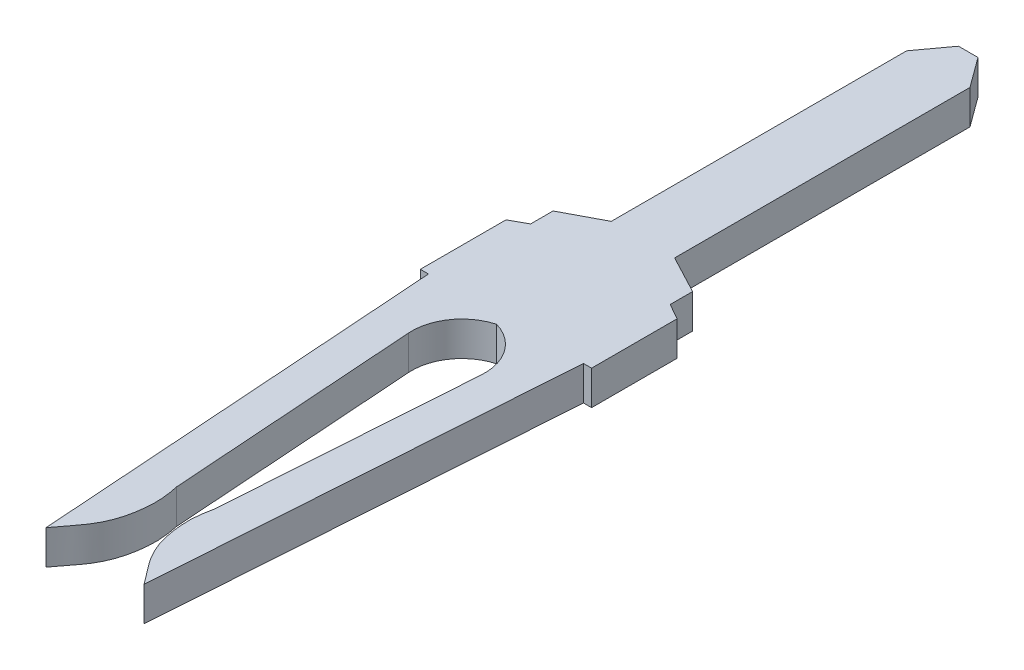
ISO-10303-21;
HEADER;
FILE_DESCRIPTION(('STEP AP214'),'2;1');
FILE_NAME('part.step','',(''),(''),'','','');
FILE_SCHEMA(('AUTOMOTIVE_DESIGN { 1 0 10303 214 1 1 1 1 }'));
ENDSEC;
DATA;
#1=APPLICATION_CONTEXT('core data for automotive mechanical design processes');
#2=APPLICATION_PROTOCOL_DEFINITION('international standard','automotive_design',2000,#1);
#3=PRODUCT_CONTEXT('',#1,'mechanical');
#4=PRODUCT('Part','Part','',(#3));
#5=PRODUCT_RELATED_PRODUCT_CATEGORY('part','',(#4));
#6=PRODUCT_DEFINITION_FORMATION('','',#4);
#7=PRODUCT_DEFINITION_CONTEXT('part definition',#1,'design');
#8=PRODUCT_DEFINITION('design','',#6,#7);
#9=PRODUCT_DEFINITION_SHAPE('','',#8);
#10=(LENGTH_UNIT() NAMED_UNIT(*) SI_UNIT(.MILLI.,.METRE.));
#11=(NAMED_UNIT(*) PLANE_ANGLE_UNIT() SI_UNIT($,.RADIAN.));
#12=(NAMED_UNIT(*) SI_UNIT($,.STERADIAN.) SOLID_ANGLE_UNIT());
#13=UNCERTAINTY_MEASURE_WITH_UNIT(LENGTH_MEASURE(1.E-05),#10,'distance_accuracy_value','');
#14=(GEOMETRIC_REPRESENTATION_CONTEXT(3) GLOBAL_UNCERTAINTY_ASSIGNED_CONTEXT((#13)) GLOBAL_UNIT_ASSIGNED_CONTEXT((#10,
#11,#12)) REPRESENTATION_CONTEXT('',''));
#15=CARTESIAN_POINT('',(0.,0.,0.));
#16=DIRECTION('',(0.,0.,1.));
#17=DIRECTION('',(1.,0.,0.));
#18=AXIS2_PLACEMENT_3D('',#15,#16,#17);
#19=CARTESIAN_POINT('',(13.7238483037714,-0.2,2.31459805115651));
#20=DIRECTION('',(0.,1.,0.));
#21=DIRECTION('',(0.,0.,1.));
#22=AXIS2_PLACEMENT_3D('',#19,#20,#21);
#23=PLANE('',#22);
#24=DIRECTION('',(1.,0.,0.));
#25=VECTOR('',#24,1.);
#26=CARTESIAN_POINT('',(13.7238483037714,-0.2,-7.36150336113542));
#27=LINE('',#26,#25);
#28=CARTESIAN_POINT('',(14.0838737533966,-0.2,-7.36150336113542));
#29=VERTEX_POINT('',#28);
#30=CARTESIAN_POINT('',(13.8561262466034,-0.2,-7.36150336113542));
#31=VERTEX_POINT('',#30);
#32=EDGE_CURVE('E283',#29,#31,#27,.F.);
#33=ORIENTED_EDGE('',*,*,#32,.F.);
#34=DIRECTION('',(-0.590553070886652,0.,-0.806998804501187));
#35=VECTOR('',#34,1.);
#36=CARTESIAN_POINT('',(14.34,-0.2,-7.01150336113544));
#37=LINE('',#36,#35);
#38=CARTESIAN_POINT('',(14.34,-0.2,-7.01150336113544));
#39=VERTEX_POINT('',#38);
#40=EDGE_CURVE('E332',#39,#29,#37,.T.);
#41=ORIENTED_EDGE('',*,*,#40,.F.);
#42=DIRECTION('',(0.,0.,1.));
#43=VECTOR('',#42,1.);
#44=CARTESIAN_POINT('',(14.34,-0.2,-3.56150336113542));
#45=LINE('',#44,#43);
#46=CARTESIAN_POINT('',(14.34,-0.2,-3.56150336113542));
#47=VERTEX_POINT('',#46);
#48=EDGE_CURVE('E342',#39,#47,#45,.T.);
#49=ORIENTED_EDGE('',*,*,#48,.T.);
#50=DIRECTION('',(0.884537528884384,0.,0.466469034336801));
#51=VECTOR('',#50,1.);
#52=CARTESIAN_POINT('',(14.7850492275891,-0.2,-3.32680254104964));
#53=LINE('',#52,#51);
#54=CARTESIAN_POINT('',(14.7850492275891,-0.2,-3.32680254104964));
#55=VERTEX_POINT('',#54);
#56=EDGE_CURVE('E512',#47,#55,#53,.T.);
#57=ORIENTED_EDGE('',*,*,#56,.T.);
#58=DIRECTION('',(0.,0.,1.));
#59=VECTOR('',#58,1.);
#60=CARTESIAN_POINT('',(14.7850492275891,-0.2,-3.0643625168085));
#61=LINE('',#60,#59);
#62=CARTESIAN_POINT('',(14.7850492275891,-0.2,-3.0643625168085));
#63=VERTEX_POINT('',#62);
#64=EDGE_CURVE('E517',#55,#63,#61,.T.);
#65=ORIENTED_EDGE('',*,*,#64,.T.);
#66=DIRECTION('',(0.873939082125311,0.,0.486035472711579));
#67=VECTOR('',#66,1.);
#68=CARTESIAN_POINT('',(14.97,-0.2,-2.96150336113542));
#69=LINE('',#68,#67);
#70=CARTESIAN_POINT('',(14.97,-0.2,-2.96150336113542));
#71=VERTEX_POINT('',#70);
#72=EDGE_CURVE('E522',#63,#71,#69,.T.);
#73=ORIENTED_EDGE('',*,*,#72,.T.);
#74=DIRECTION('',(0.,0.,1.));
#75=VECTOR('',#74,1.);
#76=CARTESIAN_POINT('',(14.97,-0.2,-1.96150336113542));
#77=LINE('',#76,#75);
#78=CARTESIAN_POINT('',(14.97,-0.2,-1.96150336113542));
#79=VERTEX_POINT('',#78);
#80=EDGE_CURVE('E527',#71,#79,#77,.T.);
#81=ORIENTED_EDGE('',*,*,#80,.T.);
#82=DIRECTION('',(-1.,0.,0.));
#83=VECTOR('',#82,1.);
#84=CARTESIAN_POINT('',(14.8753470294773,-0.2,-1.96150336113542));
#85=LINE('',#84,#83);
#86=CARTESIAN_POINT('',(14.8753470294773,-0.2,-1.96150336113542));
#87=VERTEX_POINT('',#86);
#88=EDGE_CURVE('E293',#79,#87,#85,.T.);
#89=ORIENTED_EDGE('',*,*,#88,.T.);
#90=DIRECTION('',(-0.069129081289101,0.,0.997607723566796));
#91=VECTOR('',#90,1.);
#92=CARTESIAN_POINT('',(14.5427317315511,-0.2,2.83849663886458));
#93=LINE('',#92,#91);
#94=CARTESIAN_POINT('',(14.5427317315511,-0.199999999998636,2.83849663886458));
#95=VERTEX_POINT('',#94);
#96=EDGE_CURVE('E286',#87,#95,#93,.T.);
#97=ORIENTED_EDGE('',*,*,#96,.T.);
#98=CARTESIAN_POINT('',(14.5427317315511,-0.199999999997272,2.83849663886458));
#99=CARTESIAN_POINT('',(14.5301117840465,-0.199999999999036,2.82035634566084));
#100=CARTESIAN_POINT('',(14.5171085897647,-0.199999999999745,2.80249703632862));
#101=CARTESIAN_POINT('',(14.4905978922961,-0.200000000000256,2.767067271672));
#102=CARTESIAN_POINT('',(14.4770889362865,-0.200000000000054,2.74949789706299));
#103=CARTESIAN_POINT('',(14.4498889977379,-0.199999999999946,2.71445646704448));
#104=CARTESIAN_POINT('',(14.436197747636,-0.200000000000041,2.69698462458868));
#105=CARTESIAN_POINT('',(14.4088690336099,-0.199999999999959,2.66179280032601));
#106=CARTESIAN_POINT('',(14.3952326861093,-0.199999999999781,2.64407193802588));
#107=CARTESIAN_POINT('',(14.3684870174647,-0.200000000000219,2.60827495637831));
#108=CARTESIAN_POINT('',(14.3553768963667,-0.200000000000835,2.59019944367523));
#109=CARTESIAN_POINT('',(14.3301101020069,-0.199999999999166,2.55341394187299));
#110=CARTESIAN_POINT('',(14.3179523577802,-0.199999999996886,2.53470470035233));
#111=CARTESIAN_POINT('',(14.2888528005844,-0.199999999995555,2.48610541444836));
#112=CARTESIAN_POINT('',(14.2728705856211,-0.199999999998911,2.4556309694467));
#113=CARTESIAN_POINT('',(14.2442782559242,-0.20000000000109,2.39311864961096));
#114=CARTESIAN_POINT('',(14.2316716205826,-0.199999999999908,2.36107920154643));
#115=CARTESIAN_POINT('',(14.2098063400518,-0.200000000000092,2.29605579046403));
#116=CARTESIAN_POINT('',(14.2005321464449,-0.200000000001447,2.26307700968106));
#117=CARTESIAN_POINT('',(14.1849803350698,-0.199999999998552,2.19641558649373));
#118=CARTESIAN_POINT('',(14.1787038833698,-0.199999999994301,2.1627326755041));
#119=CARTESIAN_POINT('',(14.1716427674148,-0.199999999997239,2.11445873714291));
#120=CARTESIAN_POINT('',(14.1697745540675,-0.199999999999259,2.10001577275484));
#121=CARTESIAN_POINT('',(14.1664895700981,-0.200000000000741,2.07107657672707));
#122=CARTESIAN_POINT('',(14.1650728382844,-0.200000000000201,2.0565803406165));
#123=CARTESIAN_POINT('',(14.162648947746,-0.199999999999799,2.02756428018602));
#124=CARTESIAN_POINT('',(14.1616415125079,-0.199999999999936,2.01304447846682));
#125=CARTESIAN_POINT('',(14.1600578978784,-0.200000000000065,1.98398161590975));
#126=CARTESIAN_POINT('',(14.1594816668501,-0.200000000000057,1.96943855806589));
#127=CARTESIAN_POINT('',(14.1589515619759,-0.199999999999943,1.94031677784536));
#128=CARTESIAN_POINT('',(14.1589986410578,-0.199999999999836,1.92573803493692));
#129=CARTESIAN_POINT('',(14.1597587559285,-0.200000000000164,1.89659865640506));
#130=CARTESIAN_POINT('',(14.1604717976268,-0.200000000000597,1.88203802094347));
#131=CARTESIAN_POINT('',(14.1635527888558,-0.199999999998806,1.8384276765421));
#132=CARTESIAN_POINT('',(14.1668624883897,-0.199999999993491,1.8094421190335));
#133=CARTESIAN_POINT('',(14.1725344170494,-0.199999999997351,1.77067562522561));
#134=CARTESIAN_POINT('',(14.1740951039794,-0.19999999999931,1.76076333321757));
#135=CARTESIAN_POINT('',(14.1774047974131,-0.20000000000069,1.74097125618797));
#136=CARTESIAN_POINT('',(14.1791537702163,-0.20000000000011,1.73109146567429));
#137=CARTESIAN_POINT('',(14.1828119125698,-0.19999999999989,1.71138684020899));
#138=CARTESIAN_POINT('',(14.1847206822217,-0.200000000000248,1.70156193004253));
#139=CARTESIAN_POINT('',(14.1886821532455,-0.199999999999752,1.68194070150381));
#140=CARTESIAN_POINT('',(14.1907348605041,-0.199999999998897,1.67214438431805));
#141=CARTESIAN_POINT('',(14.1928494979964,-0.199999999996362,1.66236165258835));
#142=B_SPLINE_CURVE_WITH_KNOTS('',3,(#98,#99,#100,#101,#102,#103,#104,#105,#106,#107,#108,#109,
#110,#111,#112,#113,#114,#115,#116,#117,#118,#119,#120,#121,#122,#123,#124,#125,#126,#127,#128,
#129,#130,#131,#132,#133,#134,#135,#136,#137,#138,#139,#140,#141),.UNSPECIFIED.,.F.,.F.,(4,2,2,
2,2,2,2,2,2,2,2,2,2,2,2,2,2,2,2,2,2,4),(0.,0.0662736292421371,0.132754965588503,
0.199347935146056,0.266425503105106,0.333396909133083,0.400291890006224,0.503292496143717,
0.606398865394113,0.709017718069728,0.811676455205095,0.855361428713374,0.899050156292408,
0.942709319294032,0.986363253255563,1.03008393384267,1.07380500239372,1.16122498556328,
1.19132837323275,1.221426381764,1.25145119993663,1.28147724680278),.UNSPECIFIED.);
#143=CARTESIAN_POINT('',(14.1928494979964,-0.199999999998636,1.66236165258835));
#144=VERTEX_POINT('',#143);
#145=EDGE_CURVE('E377',#95,#144,#142,.T.);
#146=ORIENTED_EDGE('',*,*,#145,.T.);
#147=DIRECTION('',(0.0691290812891009,0.,-0.997607723566796));
#148=VECTOR('',#147,1.);
#149=CARTESIAN_POINT('',(14.3944850572742,-0.2,-1.2474584626244));
#150=LINE('',#149,#148);
#151=CARTESIAN_POINT('',(14.3944850572742,-0.2,-1.2474584626244));
#152=VERTEX_POINT('',#151);
#153=EDGE_CURVE('E299',#144,#152,#150,.T.);
#154=ORIENTED_EDGE('',*,*,#153,.T.);
#155=CARTESIAN_POINT('',(13.8111858150643,-0.2,-1.28787809829685));
#156=DIRECTION('',(0.,-1.,0.));
#157=DIRECTION('',(0.,0.,-1.));
#158=AXIS2_PLACEMENT_3D('',#155,#156,#157);
#159=CIRCLE('',#158,0.584698001459304);
#160=CARTESIAN_POINT('',(13.97,-0.2,-1.85059455227142));
#161=VERTEX_POINT('',#160);
#162=EDGE_CURVE('E541',#152,#161,#159,.F.);
#163=ORIENTED_EDGE('',*,*,#162,.T.);
#164=CARTESIAN_POINT('',(14.1288141849357,-0.2,-1.28787809829685));
#165=DIRECTION('',(0.,-1.,0.));
#166=DIRECTION('',(0.,0.,-1.));
#167=AXIS2_PLACEMENT_3D('',#164,#165,#166);
#168=CIRCLE('',#167,0.584698001459304);
#169=CARTESIAN_POINT('',(13.5455149427258,-0.2,-1.2474584626244));
#170=VERTEX_POINT('',#169);
#171=EDGE_CURVE('E543',#161,#170,#168,.F.);
#172=ORIENTED_EDGE('',*,*,#171,.T.);
#173=DIRECTION('',(0.0691290812891009,0.,0.997607723566796));
#174=VECTOR('',#173,1.);
#175=CARTESIAN_POINT('',(13.7471505020036,-0.2,1.66236165258835));
#176=LINE('',#175,#174);
#177=CARTESIAN_POINT('',(13.7471505020036,-0.199999999998636,1.66236165258835));
#178=VERTEX_POINT('',#177);
#179=EDGE_CURVE('E193',#170,#178,#176,.T.);
#180=ORIENTED_EDGE('',*,*,#179,.T.);
#181=CARTESIAN_POINT('',(13.7471505020036,-0.199999999997272,1.66236165258835));
#182=CARTESIAN_POINT('',(13.7506930434582,-0.199999999999021,1.67876516898736));
#183=CARTESIAN_POINT('',(13.7540668961465,-0.199999999999738,1.69520814063054));
#184=CARTESIAN_POINT('',(13.760373512311,-0.200000000000262,1.72819425344364));
#185=CARTESIAN_POINT('',(13.7633058514325,-0.200000000000069,1.74473747528483));
#186=CARTESIAN_POINT('',(13.768612950942,-0.199999999999931,1.77787904842356));
#187=CARTESIAN_POINT('',(13.7709888742904,-0.199999999999986,1.79447720985483));
#188=CARTESIAN_POINT('',(13.7750561261357,-0.200000000000014,1.82775267562321));
#189=CARTESIAN_POINT('',(13.7767477090657,-0.199999999999986,1.84442994820983));
#190=CARTESIAN_POINT('',(13.7793404639229,-0.200000000000014,1.8781658536101));
#191=CARTESIAN_POINT('',(13.7802260479731,-0.200000000000071,1.89522572372273));
#192=CARTESIAN_POINT('',(13.781074176234,-0.199999999999929,1.92937070365721));
#193=CARTESIAN_POINT('',(13.7810365963276,-0.199999999999728,1.94645581656411));
#194=CARTESIAN_POINT('',(13.7801464087162,-0.200000000000272,1.98060739462667));
#195=CARTESIAN_POINT('',(13.7792934932804,-0.200000000001016,1.99767385030562));
#196=CARTESIAN_POINT('',(13.7770512403936,-0.199999999998984,2.03177190457364));
#197=CARTESIAN_POINT('',(13.7756618445344,-0.199999999996208,2.04880349916423));
#198=CARTESIAN_POINT('',(13.7724418258441,-0.199999999996501,2.08117364432391));
#199=CARTESIAN_POINT('',(13.7706664509372,-0.199999999999035,2.09651757337598));
#200=CARTESIAN_POINT('',(13.7665920149137,-0.200000000000965,2.12713142079618));
#201=CARTESIAN_POINT('',(13.7642930727049,-0.200000000000362,2.14240135516632));
#202=CARTESIAN_POINT('',(13.7565568923818,-0.199999999999275,2.18806423356644));
#203=CARTESIAN_POINT('',(13.7502792180355,-0.199999999999511,2.21832169210074));
#204=CARTESIAN_POINT('',(13.7353049896006,-0.200000000000485,2.27794628837999));
#205=CARTESIAN_POINT('',(13.7266307283313,-0.200000000001218,2.30731899012436));
#206=CARTESIAN_POINT('',(13.7066639429989,-0.199999999998782,2.36515776174417));
#207=CARTESIAN_POINT('',(13.6953725781304,-0.199999999995614,2.3936242266889));
#208=CARTESIAN_POINT('',(13.6741167492533,-0.199999999996873,2.44050994607598));
#209=CARTESIAN_POINT('',(13.6648651860701,-0.199999999999213,2.45925514878721));
#210=CARTESIAN_POINT('',(13.6451148381145,-0.200000000000787,2.49607002593636));
#211=CARTESIAN_POINT('',(13.634616549394,-0.200000000000022,2.51413996531327));
#212=CARTESIAN_POINT('',(13.6124016014869,-0.199999999999977,2.5496512250529));
#213=CARTESIAN_POINT('',(13.6006783041642,-0.200000000000705,2.56708834895095));
#214=CARTESIAN_POINT('',(13.5765014836541,-0.199999999999295,2.60145165600187));
#215=CARTESIAN_POINT('',(13.5640476322362,-0.199999999997155,2.61837760423457));
#216=CARTESIAN_POINT('',(13.5256576601351,-0.199999999994748,2.66929403747489));
#217=CARTESIAN_POINT('',(13.4991085517752,-0.19999999999871,2.70281440404767));
#218=CARTESIAN_POINT('',(13.4599612186542,-0.200000000000638,2.75332926249143));
#219=CARTESIAN_POINT('',(13.4470934447163,-0.200000000000622,2.77011410702205));
#220=CARTESIAN_POINT('',(13.4217901054739,-0.199999999999378,2.80401275870947));
#221=CARTESIAN_POINT('',(13.4093546734732,-0.199999999998149,2.82112666484357));
#222=CARTESIAN_POINT('',(13.3972682684489,-0.199999999996362,2.83849663886458));
#223=B_SPLINE_CURVE_WITH_KNOTS('',3,(#181,#182,#183,#184,#185,#186,#187,#188,#189,#190,#191,
#192,#193,#194,#195,#196,#197,#198,#199,#200,#201,#202,#203,#204,#205,#206,#207,#208,#209,#210,
#211,#212,#213,#214,#215,#216,#217,#218,#219,#220,#221,#222),.UNSPECIFIED.,.F.,.F.,(4,2,2,2,2,2,
2,2,2,2,2,2,2,2,2,2,2,2,2,2,4),(0.,0.0503486093503747,0.100745305838358,0.151035709247431,
0.201307397797674,0.252531860559853,0.303763210359028,0.35501390396404,0.406270178969422,
0.4525996658291,0.498918641247276,0.591522198393347,0.683291796484336,0.775020824454853,
0.837689524225669,0.900333372155572,0.963336258472885,1.02636767143342,1.15463805260592,
1.21808246522332,1.28154626921388),.UNSPECIFIED.);
#224=CARTESIAN_POINT('',(13.3972682684489,-0.199999999998636,2.83849663886458));
#225=VERTEX_POINT('',#224);
#226=EDGE_CURVE('E24',#178,#225,#223,.T.);
#227=ORIENTED_EDGE('',*,*,#226,.T.);
#228=DIRECTION('',(-0.069129081289101,0.,-0.997607723566796));
#229=VECTOR('',#228,1.);
#230=CARTESIAN_POINT('',(13.0646529705227,-0.2,-1.96150336113542));
#231=LINE('',#230,#229);
#232=CARTESIAN_POINT('',(13.0646529705227,-0.2,-1.96150336113542));
#233=VERTEX_POINT('',#232);
#234=EDGE_CURVE('E182',#225,#233,#231,.T.);
#235=ORIENTED_EDGE('',*,*,#234,.T.);
#236=DIRECTION('',(-1.,0.,0.));
#237=VECTOR('',#236,1.);
#238=CARTESIAN_POINT('',(12.97,-0.2,-1.96150336113542));
#239=LINE('',#238,#237);
#240=CARTESIAN_POINT('',(12.97,-0.2,-1.96150336113542));
#241=VERTEX_POINT('',#240);
#242=EDGE_CURVE('E205',#233,#241,#239,.T.);
#243=ORIENTED_EDGE('',*,*,#242,.T.);
#244=DIRECTION('',(0.,0.,-1.));
#245=VECTOR('',#244,1.);
#246=CARTESIAN_POINT('',(12.97,-0.2,-2.96150336113542));
#247=LINE('',#246,#245);
#248=CARTESIAN_POINT('',(12.97,-0.2,-2.96150336113542));
#249=VERTEX_POINT('',#248);
#250=EDGE_CURVE('E217',#241,#249,#247,.T.);
#251=ORIENTED_EDGE('',*,*,#250,.T.);
#252=DIRECTION('',(0.873939082125311,0.,-0.486035472711579));
#253=VECTOR('',#252,1.);
#254=CARTESIAN_POINT('',(13.1549507724109,-0.2,-3.0643625168085));
#255=LINE('',#254,#253);
#256=CARTESIAN_POINT('',(13.1549507724109,-0.2,-3.0643625168085));
#257=VERTEX_POINT('',#256);
#258=EDGE_CURVE('E227',#249,#257,#255,.T.);
#259=ORIENTED_EDGE('',*,*,#258,.T.);
#260=DIRECTION('',(0.,0.,-1.));
#261=VECTOR('',#260,1.);
#262=CARTESIAN_POINT('',(13.1549507724109,-0.2,-3.32680254104964));
#263=LINE('',#262,#261);
#264=CARTESIAN_POINT('',(13.1549507724109,-0.2,-3.32680254104964));
#265=VERTEX_POINT('',#264);
#266=EDGE_CURVE('E237',#257,#265,#263,.T.);
#267=ORIENTED_EDGE('',*,*,#266,.T.);
#268=DIRECTION('',(0.884537528884384,0.,-0.466469034336801));
#269=VECTOR('',#268,1.);
#270=CARTESIAN_POINT('',(13.6,-0.2,-3.56150336113542));
#271=LINE('',#270,#269);
#272=CARTESIAN_POINT('',(13.6,-0.2,-3.56150336113542));
#273=VERTEX_POINT('',#272);
#274=EDGE_CURVE('E247',#265,#273,#271,.T.);
#275=ORIENTED_EDGE('',*,*,#274,.T.);
#276=DIRECTION('',(0.,0.,-1.));
#277=VECTOR('',#276,1.);
#278=CARTESIAN_POINT('',(13.6,-0.2,-7.01150336113544));
#279=LINE('',#278,#277);
#280=CARTESIAN_POINT('',(13.6,-0.2,-7.01150336113544));
#281=VERTEX_POINT('',#280);
#282=EDGE_CURVE('E257',#273,#281,#279,.T.);
#283=ORIENTED_EDGE('',*,*,#282,.T.);
#284=DIRECTION('',(0.590553070886641,0.,-0.806998804501195));
#285=VECTOR('',#284,1.);
#286=CARTESIAN_POINT('',(13.8561262466034,-0.2,-7.36150336113542));
#287=LINE('',#286,#285);
#288=EDGE_CURVE('E267',#281,#31,#287,.T.);
#289=ORIENTED_EDGE('',*,*,#288,.T.);
#290=EDGE_LOOP('',(#33,#41,#49,#57,#65,#73,#81,#89,#97,#146,#154,#163,#172,#180,#227,#235,#243,
#251,#259,#267,#275,#283,#289));
#291=FACE_BOUND('',#290,.T.);
#292=ADVANCED_FACE('F17',(#291),#23,.F.);
#293=CARTESIAN_POINT('',(13.8561262466034,0.2,-7.36150336113542));
#294=DIRECTION('',(0.806998804501195,0.,0.590553070886641));
#295=DIRECTION('',(0.590553070886641,0.,-0.806998804501195));
#296=AXIS2_PLACEMENT_3D('',#293,#294,#295);
#297=PLANE('',#296);
#298=DIRECTION('',(0.,1.,0.));
#299=VECTOR('',#298,1.);
#300=CARTESIAN_POINT('',(13.6,0.2,-7.01150336113544));
#301=LINE('',#300,#299);
#302=CARTESIAN_POINT('',(13.6,0.2,-7.01150336113544));
#303=VERTEX_POINT('',#302);
#304=EDGE_CURVE('E265',#281,#303,#301,.T.);
#305=ORIENTED_EDGE('',*,*,#304,.T.);
#306=DIRECTION('',(-0.590553070886652,0.,0.806998804501187));
#307=VECTOR('',#306,1.);
#308=CARTESIAN_POINT('',(13.8561262466034,0.2,-7.36150336113542));
#309=LINE('',#308,#307);
#310=CARTESIAN_POINT('',(13.8561262466034,0.2,-7.36150336113542));
#311=VERTEX_POINT('',#310);
#312=EDGE_CURVE('E262',#311,#303,#309,.T.);
#313=ORIENTED_EDGE('',*,*,#312,.F.);
#314=DIRECTION('',(0.,1.,0.));
#315=VECTOR('',#314,1.);
#316=CARTESIAN_POINT('',(13.8561262466034,0.2,-7.36150336113542));
#317=LINE('',#316,#315);
#318=EDGE_CURVE('E272',#311,#31,#317,.F.);
#319=ORIENTED_EDGE('',*,*,#318,.T.);
#320=ORIENTED_EDGE('',*,*,#288,.F.);
#321=EDGE_LOOP('',(#305,#313,#319,#320));
#322=FACE_BOUND('',#321,.T.);
#323=ADVANCED_FACE('F396',(#322),#297,.F.);
#324=CARTESIAN_POINT('',(13.6,0.2,-7.01150336113544));
#325=DIRECTION('',(1.,0.,0.));
#326=DIRECTION('',(0.,0.,-1.));
#327=AXIS2_PLACEMENT_3D('',#324,#325,#326);
#328=PLANE('',#327);
#329=DIRECTION('',(0.,1.,0.));
#330=VECTOR('',#329,1.);
#331=CARTESIAN_POINT('',(13.6,0.2,-3.56150336113542));
#332=LINE('',#331,#330);
#333=CARTESIAN_POINT('',(13.6,0.2,-3.56150336113542));
#334=VERTEX_POINT('',#333);
#335=EDGE_CURVE('E255',#273,#334,#332,.T.);
#336=ORIENTED_EDGE('',*,*,#335,.T.);
#337=DIRECTION('',(0.,0.,1.));
#338=VECTOR('',#337,1.);
#339=CARTESIAN_POINT('',(13.6,0.2,2.31459805115651));
#340=LINE('',#339,#338);
#341=EDGE_CURVE('E252',#303,#334,#340,.T.);
#342=ORIENTED_EDGE('',*,*,#341,.F.);
#343=ORIENTED_EDGE('',*,*,#304,.F.);
#344=ORIENTED_EDGE('',*,*,#282,.F.);
#345=EDGE_LOOP('',(#336,#342,#343,#344));
#346=FACE_BOUND('',#345,.T.);
#347=ADVANCED_FACE('F400',(#346),#328,.F.);
#348=CARTESIAN_POINT('',(13.6,0.2,-3.56150336113542));
#349=DIRECTION('',(0.466469034336801,0.,0.884537528884384));
#350=DIRECTION('',(0.884537528884384,0.,-0.466469034336801));
#351=AXIS2_PLACEMENT_3D('',#348,#349,#350);
#352=PLANE('',#351);
#353=DIRECTION('',(0.,1.,0.));
#354=VECTOR('',#353,1.);
#355=CARTESIAN_POINT('',(13.1549507724109,0.2,-3.32680254104964));
#356=LINE('',#355,#354);
#357=CARTESIAN_POINT('',(13.1549507724109,0.2,-3.32680254104964));
#358=VERTEX_POINT('',#357);
#359=EDGE_CURVE('E245',#265,#358,#356,.T.);
#360=ORIENTED_EDGE('',*,*,#359,.T.);
#361=DIRECTION('',(-0.884537528884383,0.,0.466469034336803));
#362=VECTOR('',#361,1.);
#363=CARTESIAN_POINT('',(13.6,0.2,-3.56150336113542));
#364=LINE('',#363,#362);
#365=EDGE_CURVE('E242',#334,#358,#364,.T.);
#366=ORIENTED_EDGE('',*,*,#365,.F.);
#367=ORIENTED_EDGE('',*,*,#335,.F.);
#368=ORIENTED_EDGE('',*,*,#274,.F.);
#369=EDGE_LOOP('',(#360,#366,#367,#368));
#370=FACE_BOUND('',#369,.T.);
#371=ADVANCED_FACE('F404',(#370),#352,.F.);
#372=CARTESIAN_POINT('',(13.1549507724109,0.2,-3.32680254104964));
#373=DIRECTION('',(1.,0.,0.));
#374=DIRECTION('',(0.,0.,-1.));
#375=AXIS2_PLACEMENT_3D('',#372,#373,#374);
#376=PLANE('',#375);
#377=DIRECTION('',(0.,1.,0.));
#378=VECTOR('',#377,1.);
#379=CARTESIAN_POINT('',(13.1549507724109,0.2,-3.0643625168085));
#380=LINE('',#379,#378);
#381=CARTESIAN_POINT('',(13.1549507724109,0.2,-3.0643625168085));
#382=VERTEX_POINT('',#381);
#383=EDGE_CURVE('E235',#257,#382,#380,.T.);
#384=ORIENTED_EDGE('',*,*,#383,.T.);
#385=DIRECTION('',(0.,0.,1.));
#386=VECTOR('',#385,1.);
#387=CARTESIAN_POINT('',(13.1549507724109,0.2,2.31459805115651));
#388=LINE('',#387,#386);
#389=EDGE_CURVE('E232',#358,#382,#388,.T.);
#390=ORIENTED_EDGE('',*,*,#389,.F.);
#391=ORIENTED_EDGE('',*,*,#359,.F.);
#392=ORIENTED_EDGE('',*,*,#266,.F.);
#393=EDGE_LOOP('',(#384,#390,#391,#392));
#394=FACE_BOUND('',#393,.T.);
#395=ADVANCED_FACE('F408',(#394),#376,.F.);
#396=CARTESIAN_POINT('',(13.1549507724109,0.2,-3.0643625168085));
#397=DIRECTION('',(0.486035472711579,0.,0.873939082125311));
#398=DIRECTION('',(0.873939082125311,0.,-0.486035472711579));
#399=AXIS2_PLACEMENT_3D('',#396,#397,#398);
#400=PLANE('',#399);
#401=DIRECTION('',(0.,1.,0.));
#402=VECTOR('',#401,1.);
#403=CARTESIAN_POINT('',(12.97,0.2,-2.96150336113542));
#404=LINE('',#403,#402);
#405=CARTESIAN_POINT('',(12.97,0.2,-2.96150336113542));
#406=VERTEX_POINT('',#405);
#407=EDGE_CURVE('E225',#249,#406,#404,.T.);
#408=ORIENTED_EDGE('',*,*,#407,.T.);
#409=DIRECTION('',(-0.873939082125311,0.,0.486035472711581));
#410=VECTOR('',#409,1.);
#411=CARTESIAN_POINT('',(13.1549507724109,0.2,-3.0643625168085));
#412=LINE('',#411,#410);
#413=EDGE_CURVE('E222',#382,#406,#412,.T.);
#414=ORIENTED_EDGE('',*,*,#413,.F.);
#415=ORIENTED_EDGE('',*,*,#383,.F.);
#416=ORIENTED_EDGE('',*,*,#258,.F.);
#417=EDGE_LOOP('',(#408,#414,#415,#416));
#418=FACE_BOUND('',#417,.T.);
#419=ADVANCED_FACE('F412',(#418),#400,.F.);
#420=CARTESIAN_POINT('',(12.97,0.2,-2.96150336113542));
#421=DIRECTION('',(1.,0.,0.));
#422=DIRECTION('',(0.,0.,-1.));
#423=AXIS2_PLACEMENT_3D('',#420,#421,#422);
#424=PLANE('',#423);
#425=DIRECTION('',(0.,1.,0.));
#426=VECTOR('',#425,1.);
#427=CARTESIAN_POINT('',(12.97,0.2,-1.96150336113542));
#428=LINE('',#427,#426);
#429=CARTESIAN_POINT('',(12.97,0.2,-1.96150336113542));
#430=VERTEX_POINT('',#429);
#431=EDGE_CURVE('E215',#241,#430,#428,.T.);
#432=ORIENTED_EDGE('',*,*,#431,.T.);
#433=DIRECTION('',(0.,0.,1.));
#434=VECTOR('',#433,1.);
#435=CARTESIAN_POINT('',(12.97,0.2,2.31459805115651));
#436=LINE('',#435,#434);
#437=EDGE_CURVE('E212',#406,#430,#436,.T.);
#438=ORIENTED_EDGE('',*,*,#437,.F.);
#439=ORIENTED_EDGE('',*,*,#407,.F.);
#440=ORIENTED_EDGE('',*,*,#250,.F.);
#441=EDGE_LOOP('',(#432,#438,#439,#440));
#442=FACE_BOUND('',#441,.T.);
#443=ADVANCED_FACE('F416',(#442),#424,.F.);
#444=CARTESIAN_POINT('',(12.97,0.2,-1.96150336113542));
#445=DIRECTION('',(0.,0.,-1.));
#446=DIRECTION('',(-1.,0.,0.));
#447=AXIS2_PLACEMENT_3D('',#444,#445,#446);
#448=PLANE('',#447);
#449=DIRECTION('',(0.,1.,0.));
#450=VECTOR('',#449,1.);
#451=CARTESIAN_POINT('',(13.0646529705227,0.2,-1.96150336113542));
#452=LINE('',#451,#450);
#453=CARTESIAN_POINT('',(13.0646529705227,0.2,-1.96150336113542));
#454=VERTEX_POINT('',#453);
#455=EDGE_CURVE('E187',#233,#454,#452,.T.);
#456=ORIENTED_EDGE('',*,*,#455,.T.);
#457=DIRECTION('',(1.,0.,0.));
#458=VECTOR('',#457,1.);
#459=CARTESIAN_POINT('',(13.7238483037714,0.2,-1.96150336113542));
#460=LINE('',#459,#458);
#461=EDGE_CURVE('E208',#430,#454,#460,.T.);
#462=ORIENTED_EDGE('',*,*,#461,.F.);
#463=ORIENTED_EDGE('',*,*,#431,.F.);
#464=ORIENTED_EDGE('',*,*,#242,.F.);
#465=EDGE_LOOP('',(#456,#462,#463,#464));
#466=FACE_BOUND('',#465,.T.);
#467=ADVANCED_FACE('F420',(#466),#448,.F.);
#468=CARTESIAN_POINT('',(13.0646529705227,0.2,-1.96150336113542));
#469=DIRECTION('',(0.997607723566796,0.,-0.069129081289101));
#470=DIRECTION('',(-0.069129081289101,0.,-0.997607723566796));
#471=AXIS2_PLACEMENT_3D('',#468,#469,#470);
#472=PLANE('',#471);
#473=DIRECTION('',(0.,1.,0.));
#474=VECTOR('',#473,1.);
#475=CARTESIAN_POINT('',(13.3972682684489,7.27594525427866E-13,2.83849663886458));
#476=LINE('',#475,#474);
#477=CARTESIAN_POINT('',(13.3972682684489,0.199999999999727,2.83849663886458));
#478=VERTEX_POINT('',#477);
#479=EDGE_CURVE('E185',#225,#478,#476,.T.);
#480=ORIENTED_EDGE('',*,*,#479,.T.);
#481=DIRECTION('',(0.0691290812891011,0.,0.997607723566796));
#482=VECTOR('',#481,1.);
#483=CARTESIAN_POINT('',(13.0646529705227,0.2,-1.96150336113542));
#484=LINE('',#483,#482);
#485=EDGE_CURVE('E211',#454,#478,#484,.T.);
#486=ORIENTED_EDGE('',*,*,#485,.F.);
#487=ORIENTED_EDGE('',*,*,#455,.F.);
#488=ORIENTED_EDGE('',*,*,#234,.F.);
#489=EDGE_LOOP('',(#480,#486,#487,#488));
#490=FACE_BOUND('',#489,.T.);
#491=ADVANCED_FACE('F183',(#490),#472,.F.);
#492=CARTESIAN_POINT('',(13.3972682684489,0.199999999999636,2.83849663886458));
#493=CARTESIAN_POINT('',(13.3972682684489,-0.199999999998181,2.83849663886458));
#494=CARTESIAN_POINT('',(13.4736771410361,0.199999999999636,2.72867175501363));
#495=CARTESIAN_POINT('',(13.4736771410361,-0.199999999998181,2.72867175501363));
#496=CARTESIAN_POINT('',(13.6984603558022,0.199999999999636,2.48163512099619));
#497=CARTESIAN_POINT('',(13.6984603558022,-0.199999999998181,2.48163512099619));
#498=CARTESIAN_POINT('',(13.788558845723,0.199999999999636,2.09927230325975));
#499=CARTESIAN_POINT('',(13.788558845723,-0.199999999998181,2.09927230325975));
#500=CARTESIAN_POINT('',(13.7820146019548,0.199999999999636,1.82360961972657));
#501=CARTESIAN_POINT('',(13.7820146019548,-0.199999999998181,1.82360961972657));
#502=CARTESIAN_POINT('',(13.7471505020036,0.199999999999636,1.66236165258835));
#503=CARTESIAN_POINT('',(13.7471505020036,-0.199999999998181,1.66236165258835));
#504=B_SPLINE_SURFACE_WITH_KNOTS('',3,1,((#492,#493),(#494,#495),(#496,#497),(#498,#499),(#500,
#501),(#502,#503)),.UNSPECIFIED.,.F.,.F.,.F.,(4,1,1,4),(2,2),(0.,0.306412493735712,
0.766000125066746,1.),(0.,0.399999999997817),.UNSPECIFIED.);
#505=DIRECTION('',(0.,1.,0.));
#506=VECTOR('',#505,1.);
#507=CARTESIAN_POINT('',(13.7471505020036,0.2,1.66236165258835));
#508=LINE('',#507,#506);
#509=CARTESIAN_POINT('',(13.7471505020036,0.2,1.66236165258835));
#510=VERTEX_POINT('',#509);
#511=EDGE_CURVE('E195',#178,#510,#508,.T.);
#512=CARTESIAN_POINT('',(13.3972682684489,0.199999999999454,2.83849663886458));
#513=CARTESIAN_POINT('',(13.4098882159535,0.199999999999805,2.82035634566084));
#514=CARTESIAN_POINT('',(13.4228914102353,0.199999999999948,2.80249703632862));
#515=CARTESIAN_POINT('',(13.4494021077039,0.200000000000052,2.767067271672));
#516=CARTESIAN_POINT('',(13.4629110637135,0.200000000000012,2.749497897063));
#517=CARTESIAN_POINT('',(13.4901110022621,0.199999999999988,2.71445646704449));
#518=CARTESIAN_POINT('',(13.503802252364,0.200000000000002,2.69698462458868));
#519=CARTESIAN_POINT('',(13.5311309663901,0.199999999999998,2.66179280032601));
#520=CARTESIAN_POINT('',(13.5447673138907,0.199999999999979,2.64407193802589));
#521=CARTESIAN_POINT('',(13.5715129825353,0.200000000000021,2.60827495637831));
#522=CARTESIAN_POINT('',(13.5846231036333,0.200000000000083,2.59019944367523));
#523=CARTESIAN_POINT('',(13.6098898979931,0.199999999999917,2.55341394187299));
#524=CARTESIAN_POINT('',(13.6220476422198,0.199999999999689,2.53470470035233));
#525=CARTESIAN_POINT('',(13.6511471994156,0.199999999999555,2.48610541444836));
#526=CARTESIAN_POINT('',(13.6671294143789,0.199999999999891,2.4556309694467));
#527=CARTESIAN_POINT('',(13.6957217440758,0.200000000000109,2.39311864961096));
#528=CARTESIAN_POINT('',(13.7083283794174,0.199999999999991,2.36107920154642));
#529=CARTESIAN_POINT('',(13.7301936599482,0.200000000000009,2.29605579046403));
#530=CARTESIAN_POINT('',(13.7394678535551,0.200000000000145,2.26307700968106));
#531=CARTESIAN_POINT('',(13.7550196649302,0.199999999999855,2.19641558649373));
#532=CARTESIAN_POINT('',(13.7612961166302,0.19999999999943,2.1627326755041));
#533=CARTESIAN_POINT('',(13.7683572325852,0.199999999999724,2.11445873714291));
#534=CARTESIAN_POINT('',(13.7702254459325,0.199999999999926,2.10001577275484));
#535=CARTESIAN_POINT('',(13.7735104299019,0.200000000000074,2.07107657672707));
#536=CARTESIAN_POINT('',(13.7749271617156,0.20000000000002,2.0565803406165));
#537=CARTESIAN_POINT('',(13.777351052254,0.19999999999998,2.02756428018602));
#538=CARTESIAN_POINT('',(13.7783584874921,0.199999999999994,2.01304447846682));
#539=CARTESIAN_POINT('',(13.7799421021216,0.200000000000006,1.98398161590974));
#540=CARTESIAN_POINT('',(13.7805183331499,0.200000000000006,1.96943855806589));
#541=CARTESIAN_POINT('',(13.7810484380241,0.199999999999994,1.94031677784536));
#542=CARTESIAN_POINT('',(13.7810013589422,0.199999999999984,1.92573803493692));
#543=CARTESIAN_POINT('',(13.7802412440715,0.200000000000016,1.89659865640506));
#544=CARTESIAN_POINT('',(13.7795282023732,0.20000000000006,1.88203802094346));
#545=CARTESIAN_POINT('',(13.7764472111442,0.199999999999881,1.83842767654209));
#546=CARTESIAN_POINT('',(13.7731375116103,0.199999999999349,1.8094421190335));
#547=CARTESIAN_POINT('',(13.7674655829506,0.199999999999735,1.77067562522561));
#548=CARTESIAN_POINT('',(13.7659048960206,0.199999999999931,1.76076333321756));
#549=CARTESIAN_POINT('',(13.7625952025869,0.200000000000069,1.74097125618797));
#550=CARTESIAN_POINT('',(13.7608462297837,0.200000000000011,1.73109146567429));
#551=CARTESIAN_POINT('',(13.7571880874302,0.199999999999989,1.71138684020899));
#552=CARTESIAN_POINT('',(13.7552793177783,0.200000000000025,1.70156193004253));
#553=CARTESIAN_POINT('',(13.7513178467545,0.199999999999975,1.68194070150381));
#554=CARTESIAN_POINT('',(13.7492651394959,0.19999999999989,1.67214438431805));
#555=CARTESIAN_POINT('',(13.7471505020036,0.199999999999636,1.66236165258835));
#556=B_SPLINE_CURVE_WITH_KNOTS('',3,(#512,#513,#514,#515,#516,#517,#518,#519,#520,#521,#522,
#523,#524,#525,#526,#527,#528,#529,#530,#531,#532,#533,#534,#535,#536,#537,#538,#539,#540,#541,
#542,#543,#544,#545,#546,#547,#548,#549,#550,#551,#552,#553,#554,#555),.UNSPECIFIED.,.F.,.F.,(4,
2,2,2,2,2,2,2,2,2,2,2,2,2,2,2,2,2,2,2,2,4),(0.,0.0662736292421344,0.132754965588502,
0.199347935146054,0.266425503105104,0.333396909133082,0.400291890006223,0.503292496143717,
0.606398865394114,0.709017718069729,0.811676455205097,0.855361428713376,0.899050156292409,
0.942709319294034,0.986363253255566,1.03008393384267,1.07380500239372,1.16122498556329,
1.19132837323275,1.221426381764,1.25145119993663,1.28147724680278),.UNSPECIFIED.);
#557=EDGE_CURVE('E198',#478,#510,#556,.T.);
#558=ORIENTED_EDGE('',*,*,#511,.T.);
#559=ORIENTED_EDGE('',*,*,#557,.F.);
#560=ORIENTED_EDGE('',*,*,#479,.F.);
#561=ORIENTED_EDGE('',*,*,#226,.F.);
#562=EDGE_LOOP('',(#558,#559,#560,#561));
#563=FACE_BOUND('',#562,.T.);
#564=ADVANCED_FACE('F196',(#563),#504,.F.);
#565=CARTESIAN_POINT('',(13.7471505020036,0.2,1.66236165258835));
#566=DIRECTION('',(-0.997607723566796,0.,0.0691290812891009));
#567=DIRECTION('',(0.0691290812891009,0.,0.997607723566796));
#568=AXIS2_PLACEMENT_3D('',#565,#566,#567);
#569=PLANE('',#568);
#570=DIRECTION('',(0.,-1.,0.));
#571=VECTOR('',#570,1.);
#572=CARTESIAN_POINT('',(13.5455149427258,0.2,-1.2474584626244));
#573=LINE('',#572,#571);
#574=CARTESIAN_POINT('',(13.5455149427258,0.2,-1.2474584626244));
#575=VERTEX_POINT('',#574);
#576=EDGE_CURVE('E304',#170,#575,#573,.F.);
#577=ORIENTED_EDGE('',*,*,#576,.T.);
#578=DIRECTION('',(-0.0691290812891005,0.,-0.997607723566796));
#579=VECTOR('',#578,1.);
#580=CARTESIAN_POINT('',(13.7471505020036,0.2,1.66236165258835));
#581=LINE('',#580,#579);
#582=EDGE_CURVE('E375',#510,#575,#581,.T.);
#583=ORIENTED_EDGE('',*,*,#582,.F.);
#584=ORIENTED_EDGE('',*,*,#511,.F.);
#585=ORIENTED_EDGE('',*,*,#179,.F.);
#586=EDGE_LOOP('',(#577,#583,#584,#585));
#587=FACE_BOUND('',#586,.T.);
#588=ADVANCED_FACE('F386',(#587),#569,.F.);
#589=CARTESIAN_POINT('',(14.1288141849357,0.2,-1.28787809829685));
#590=DIRECTION('',(0.,-1.,0.));
#591=DIRECTION('',(0.,0.,-1.));
#592=AXIS2_PLACEMENT_3D('',#589,#590,#591);
#593=CYLINDRICAL_SURFACE('',#592,0.584698001459304);
#594=DIRECTION('',(0.,-1.,0.));
#595=VECTOR('',#594,1.);
#596=CARTESIAN_POINT('',(13.97,0.2,-1.85059455227142));
#597=LINE('',#596,#595);
#598=CARTESIAN_POINT('',(13.97,0.2,-1.85059455227142));
#599=VERTEX_POINT('',#598);
#600=EDGE_CURVE('E542',#161,#599,#597,.F.);
#601=ORIENTED_EDGE('',*,*,#600,.T.);
#602=CARTESIAN_POINT('',(14.1288141849357,0.2,-1.28787809829685));
#603=DIRECTION('',(0.,-1.,0.));
#604=DIRECTION('',(0.,0.,-1.));
#605=AXIS2_PLACEMENT_3D('',#602,#603,#604);
#606=CIRCLE('',#605,0.584698001459304);
#607=EDGE_CURVE('E376',#575,#599,#606,.T.);
#608=ORIENTED_EDGE('',*,*,#607,.F.);
#609=ORIENTED_EDGE('',*,*,#576,.F.);
#610=ORIENTED_EDGE('',*,*,#171,.F.);
#611=EDGE_LOOP('',(#601,#608,#609,#610));
#612=FACE_BOUND('',#611,.T.);
#613=ADVANCED_FACE('F429',(#612),#593,.F.);
#614=CARTESIAN_POINT('',(13.8111858150643,0.2,-1.28787809829685));
#615=DIRECTION('',(0.,-1.,0.));
#616=DIRECTION('',(0.,0.,-1.));
#617=AXIS2_PLACEMENT_3D('',#614,#615,#616);
#618=CYLINDRICAL_SURFACE('',#617,0.584698001459304);
#619=DIRECTION('',(0.,1.,0.));
#620=VECTOR('',#619,1.);
#621=CARTESIAN_POINT('',(14.3944850572742,0.2,-1.2474584626244));
#622=LINE('',#621,#620);
#623=CARTESIAN_POINT('',(14.3944850572742,0.2,-1.2474584626244));
#624=VERTEX_POINT('',#623);
#625=EDGE_CURVE('E303',#152,#624,#622,.T.);
#626=ORIENTED_EDGE('',*,*,#625,.T.);
#627=CARTESIAN_POINT('',(13.8111858150643,0.2,-1.28787809829685));
#628=DIRECTION('',(0.,-1.,0.));
#629=DIRECTION('',(0.,0.,-1.));
#630=AXIS2_PLACEMENT_3D('',#627,#628,#629);
#631=CIRCLE('',#630,0.584698001459304);
#632=EDGE_CURVE('E360',#599,#624,#631,.T.);
#633=ORIENTED_EDGE('',*,*,#632,.F.);
#634=ORIENTED_EDGE('',*,*,#600,.F.);
#635=ORIENTED_EDGE('',*,*,#162,.F.);
#636=EDGE_LOOP('',(#626,#633,#634,#635));
#637=FACE_BOUND('',#636,.T.);
#638=ADVANCED_FACE('F433',(#637),#618,.F.);
#639=CARTESIAN_POINT('',(14.3944850572742,0.2,-1.2474584626244));
#640=DIRECTION('',(0.997607723566796,0.,0.0691290812891009));
#641=DIRECTION('',(0.0691290812891009,0.,-0.997607723566796));
#642=AXIS2_PLACEMENT_3D('',#639,#640,#641);
#643=PLANE('',#642);
#644=DIRECTION('',(0.,1.,0.));
#645=VECTOR('',#644,1.);
#646=CARTESIAN_POINT('',(14.1928494979964,7.27594525427866E-13,1.66236165258835));
#647=LINE('',#646,#645);
#648=CARTESIAN_POINT('',(14.1928494979964,0.199999999999727,1.66236165258835));
#649=VERTEX_POINT('',#648);
#650=EDGE_CURVE('E302',#144,#649,#647,.T.);
#651=ORIENTED_EDGE('',*,*,#650,.T.);
#652=DIRECTION('',(-0.0691290812891005,0.,0.997607723566796));
#653=VECTOR('',#652,1.);
#654=CARTESIAN_POINT('',(14.3944850572742,0.2,-1.2474584626244));
#655=LINE('',#654,#653);
#656=EDGE_CURVE('E359',#624,#649,#655,.T.);
#657=ORIENTED_EDGE('',*,*,#656,.F.);
#658=ORIENTED_EDGE('',*,*,#625,.F.);
#659=ORIENTED_EDGE('',*,*,#153,.F.);
#660=EDGE_LOOP('',(#651,#657,#658,#659));
#661=FACE_BOUND('',#660,.T.);
#662=ADVANCED_FACE('F437',(#661),#643,.F.);
#663=CARTESIAN_POINT('',(14.1928494979964,0.199999999999636,1.66236165258835));
#664=CARTESIAN_POINT('',(14.1928494979964,-0.199999999998181,1.66236165258835));
#665=CARTESIAN_POINT('',(14.1579853980452,0.199999999999636,1.82360961972657));
#666=CARTESIAN_POINT('',(14.1579853980452,-0.199999999998181,1.82360961972657));
#667=CARTESIAN_POINT('',(14.151441154277,0.199999999999636,2.09927230325975));
#668=CARTESIAN_POINT('',(14.151441154277,-0.199999999998181,2.09927230325975));
#669=CARTESIAN_POINT('',(14.2415396441978,0.199999999999636,2.48163512099619));
#670=CARTESIAN_POINT('',(14.2415396441978,-0.199999999998181,2.48163512099619));
#671=CARTESIAN_POINT('',(14.4663228589639,0.199999999999636,2.72867175501363));
#672=CARTESIAN_POINT('',(14.4663228589639,-0.199999999998181,2.72867175501363));
#673=CARTESIAN_POINT('',(14.5427317315511,0.199999999999636,2.83849663886458));
#674=CARTESIAN_POINT('',(14.5427317315511,-0.199999999998181,2.83849663886458));
#675=B_SPLINE_SURFACE_WITH_KNOTS('',3,1,((#663,#664),(#665,#666),(#667,#668),(#669,#670),(#671,
#672),(#673,#674)),.UNSPECIFIED.,.F.,.F.,.F.,(4,1,1,4),(2,2),(0.,0.233999874933255,
0.693587506264288,1.),(0.,0.399999999997817),.UNSPECIFIED.);
#676=DIRECTION('',(0.,1.,0.));
#677=VECTOR('',#676,1.);
#678=CARTESIAN_POINT('',(14.5427317315511,0.2,2.83849663886458));
#679=LINE('',#678,#677);
#680=CARTESIAN_POINT('',(14.5427317315511,0.2,2.83849663886458));
#681=VERTEX_POINT('',#680);
#682=EDGE_CURVE('E290',#95,#681,#679,.T.);
#683=CARTESIAN_POINT('',(14.1928494979964,0.199999999999454,1.66236165258835));
#684=CARTESIAN_POINT('',(14.1893069565418,0.199999999999804,1.67876516898737));
#685=CARTESIAN_POINT('',(14.1859331038535,0.199999999999948,1.69520814063054));
#686=CARTESIAN_POINT('',(14.179626487689,0.200000000000053,1.72819425344364));
#687=CARTESIAN_POINT('',(14.1766941485675,0.200000000000014,1.74473747528483));
#688=CARTESIAN_POINT('',(14.171387049058,0.199999999999986,1.77787904842356));
#689=CARTESIAN_POINT('',(14.1690111257096,0.199999999999997,1.79447720985483));
#690=CARTESIAN_POINT('',(14.1649438738643,0.200000000000003,1.82775267562321));
#691=CARTESIAN_POINT('',(14.1632522909343,0.199999999999999,1.84442994820983));
#692=CARTESIAN_POINT('',(14.1606595360771,0.200000000000001,1.8781658536101));
#693=CARTESIAN_POINT('',(14.1597739520269,0.200000000000007,1.89522572372273));
#694=CARTESIAN_POINT('',(14.158925823766,0.199999999999993,1.92937070365721));
#695=CARTESIAN_POINT('',(14.1589634036724,0.199999999999973,1.94645581656411));
#696=CARTESIAN_POINT('',(14.1598535912838,0.200000000000027,1.98060739462667));
#697=CARTESIAN_POINT('',(14.1607065067196,0.200000000000102,1.99767385030562));
#698=CARTESIAN_POINT('',(14.1629487596064,0.199999999999898,2.03177190457364));
#699=CARTESIAN_POINT('',(14.1643381554656,0.199999999999621,2.04880349916423));
#700=CARTESIAN_POINT('',(14.1675581741559,0.19999999999965,2.08117364432391));
#701=CARTESIAN_POINT('',(14.1693335490628,0.199999999999903,2.09651757337598));
#702=CARTESIAN_POINT('',(14.1734079850863,0.200000000000097,2.12713142079618));
#703=CARTESIAN_POINT('',(14.1757069272951,0.200000000000036,2.14240135516632));
#704=CARTESIAN_POINT('',(14.1834431076182,0.199999999999928,2.18806423356644));
#705=CARTESIAN_POINT('',(14.1897207819645,0.199999999999951,2.21832169210074));
#706=CARTESIAN_POINT('',(14.2046950103994,0.200000000000048,2.27794628837999));
#707=CARTESIAN_POINT('',(14.2133692716687,0.200000000000122,2.30731899012435));
#708=CARTESIAN_POINT('',(14.2333360570011,0.199999999999878,2.36515776174416));
#709=CARTESIAN_POINT('',(14.2446274218696,0.199999999999561,2.39362422668889));
#710=CARTESIAN_POINT('',(14.2658832507467,0.199999999999687,2.44050994607597));
#711=CARTESIAN_POINT('',(14.2751348139299,0.199999999999921,2.4592551487872));
#712=CARTESIAN_POINT('',(14.2948851618855,0.200000000000079,2.49607002593635));
#713=CARTESIAN_POINT('',(14.305383450606,0.200000000000002,2.51413996531327));
#714=CARTESIAN_POINT('',(14.3275983985131,0.199999999999998,2.5496512250529));
#715=CARTESIAN_POINT('',(14.3393216958358,0.200000000000071,2.56708834895095));
#716=CARTESIAN_POINT('',(14.3634985163459,0.199999999999929,2.60145165600187));
#717=CARTESIAN_POINT('',(14.3759523677638,0.199999999999716,2.61837760423457));
#718=CARTESIAN_POINT('',(14.4143423398649,0.199999999999475,2.66929403747489));
#719=CARTESIAN_POINT('',(14.4408914482248,0.199999999999871,2.70281440404767));
#720=CARTESIAN_POINT('',(14.4800387813458,0.200000000000064,2.75332926249143));
#721=CARTESIAN_POINT('',(14.4929065552837,0.200000000000062,2.77011410702205));
#722=CARTESIAN_POINT('',(14.5182098945261,0.199999999999938,2.80401275870947));
#723=CARTESIAN_POINT('',(14.5306453265268,0.199999999999815,2.82112666484357));
#724=CARTESIAN_POINT('',(14.5427317315511,0.199999999999636,2.83849663886458));
#725=B_SPLINE_CURVE_WITH_KNOTS('',3,(#683,#684,#685,#686,#687,#688,#689,#690,#691,#692,#693,
#694,#695,#696,#697,#698,#699,#700,#701,#702,#703,#704,#705,#706,#707,#708,#709,#710,#711,#712,
#713,#714,#715,#716,#717,#718,#719,#720,#721,#722,#723,#724),.UNSPECIFIED.,.F.,.F.,(4,2,2,2,2,2,
2,2,2,2,2,2,2,2,2,2,2,2,2,2,4),(0.,0.0503486093503748,0.100745305838358,0.151035709247431,
0.201307397797674,0.252531860559854,0.303763210359028,0.35501390396404,0.406270178969422,
0.452599665829099,0.498918641247274,0.591522198393343,0.683291796484329,0.775020824454844,
0.837689524225662,0.900333372155566,0.963336258472882,1.02636767143342,1.15463805260592,
1.21808246522332,1.28154626921388),.UNSPECIFIED.);
#726=EDGE_CURVE('E351',#649,#681,#725,.T.);
#727=ORIENTED_EDGE('',*,*,#682,.T.);
#728=ORIENTED_EDGE('',*,*,#726,.F.);
#729=ORIENTED_EDGE('',*,*,#650,.F.);
#730=ORIENTED_EDGE('',*,*,#145,.F.);
#731=EDGE_LOOP('',(#727,#728,#729,#730));
#732=FACE_BOUND('',#731,.T.);
#733=ADVANCED_FACE('F19',(#732),#675,.F.);
#734=CARTESIAN_POINT('',(14.5427317315511,0.2,2.83849663886458));
#735=DIRECTION('',(-0.997607723566796,0.,-0.069129081289101));
#736=DIRECTION('',(-0.069129081289101,0.,0.997607723566796));
#737=AXIS2_PLACEMENT_3D('',#734,#735,#736);
#738=PLANE('',#737);
#739=DIRECTION('',(0.,1.,0.));
#740=VECTOR('',#739,1.);
#741=CARTESIAN_POINT('',(14.8753470294773,0.2,-1.96150336113542));
#742=LINE('',#741,#740);
#743=CARTESIAN_POINT('',(14.8753470294773,0.2,-1.96150336113542));
#744=VERTEX_POINT('',#743);
#745=EDGE_CURVE('E289',#87,#744,#742,.T.);
#746=ORIENTED_EDGE('',*,*,#745,.T.);
#747=DIRECTION('',(0.0691290812891011,0.,-0.997607723566796));
#748=VECTOR('',#747,1.);
#749=CARTESIAN_POINT('',(14.5427317315511,0.2,2.83849663886458));
#750=LINE('',#749,#748);
#751=EDGE_CURVE('E358',#681,#744,#750,.T.);
#752=ORIENTED_EDGE('',*,*,#751,.F.);
#753=ORIENTED_EDGE('',*,*,#682,.F.);
#754=ORIENTED_EDGE('',*,*,#96,.F.);
#755=EDGE_LOOP('',(#746,#752,#753,#754));
#756=FACE_BOUND('',#755,.T.);
#757=ADVANCED_FACE('F442',(#756),#738,.F.);
#758=CARTESIAN_POINT('',(14.8753470294773,0.2,-1.96150336113542));
#759=DIRECTION('',(0.,0.,-1.));
#760=DIRECTION('',(-1.,0.,0.));
#761=AXIS2_PLACEMENT_3D('',#758,#759,#760);
#762=PLANE('',#761);
#763=DIRECTION('',(0.,1.,0.));
#764=VECTOR('',#763,1.);
#765=CARTESIAN_POINT('',(14.97,0.2,-1.96150336113542));
#766=LINE('',#765,#764);
#767=CARTESIAN_POINT('',(14.97,0.2,-1.96150336113542));
#768=VERTEX_POINT('',#767);
#769=EDGE_CURVE('E296',#79,#768,#766,.T.);
#770=ORIENTED_EDGE('',*,*,#769,.T.);
#771=DIRECTION('',(1.,0.,0.));
#772=VECTOR('',#771,1.);
#773=CARTESIAN_POINT('',(13.7238483037714,0.2,-1.96150336113542));
#774=LINE('',#773,#772);
#775=EDGE_CURVE('E499',#744,#768,#774,.T.);
#776=ORIENTED_EDGE('',*,*,#775,.F.);
#777=ORIENTED_EDGE('',*,*,#745,.F.);
#778=ORIENTED_EDGE('',*,*,#88,.F.);
#779=EDGE_LOOP('',(#770,#776,#777,#778));
#780=FACE_BOUND('',#779,.T.);
#781=ADVANCED_FACE('F445',(#780),#762,.F.);
#782=CARTESIAN_POINT('',(14.97,0.2,-1.96150336113542));
#783=DIRECTION('',(-1.,0.,0.));
#784=DIRECTION('',(0.,0.,1.));
#785=AXIS2_PLACEMENT_3D('',#782,#783,#784);
#786=PLANE('',#785);
#787=DIRECTION('',(0.,1.,0.));
#788=VECTOR('',#787,1.);
#789=CARTESIAN_POINT('',(14.97,0.2,-2.96150336113542));
#790=LINE('',#789,#788);
#791=CARTESIAN_POINT('',(14.97,0.2,-2.96150336113542));
#792=VERTEX_POINT('',#791);
#793=EDGE_CURVE('E525',#71,#792,#790,.T.);
#794=ORIENTED_EDGE('',*,*,#793,.T.);
#795=DIRECTION('',(0.,0.,1.));
#796=VECTOR('',#795,1.);
#797=CARTESIAN_POINT('',(14.97,0.2,2.31459805115651));
#798=LINE('',#797,#796);
#799=EDGE_CURVE('E496',#768,#792,#798,.F.);
#800=ORIENTED_EDGE('',*,*,#799,.F.);
#801=ORIENTED_EDGE('',*,*,#769,.F.);
#802=ORIENTED_EDGE('',*,*,#80,.F.);
#803=EDGE_LOOP('',(#794,#800,#801,#802));
#804=FACE_BOUND('',#803,.T.);
#805=ADVANCED_FACE('F449',(#804),#786,.F.);
#806=CARTESIAN_POINT('',(14.97,0.2,-2.96150336113542));
#807=DIRECTION('',(-0.486035472711579,0.,0.873939082125311));
#808=DIRECTION('',(0.873939082125311,0.,0.486035472711579));
#809=AXIS2_PLACEMENT_3D('',#806,#807,#808);
#810=PLANE('',#809);
#811=DIRECTION('',(0.,1.,0.));
#812=VECTOR('',#811,1.);
#813=CARTESIAN_POINT('',(14.7850492275891,0.2,-3.0643625168085));
#814=LINE('',#813,#812);
#815=CARTESIAN_POINT('',(14.7850492275891,0.2,-3.0643625168085));
#816=VERTEX_POINT('',#815);
#817=EDGE_CURVE('E520',#63,#816,#814,.T.);
#818=ORIENTED_EDGE('',*,*,#817,.T.);
#819=DIRECTION('',(-0.873939082125311,0.,-0.486035472711581));
#820=VECTOR('',#819,1.);
#821=CARTESIAN_POINT('',(14.97,0.2,-2.96150336113542));
#822=LINE('',#821,#820);
#823=EDGE_CURVE('E493',#792,#816,#822,.T.);
#824=ORIENTED_EDGE('',*,*,#823,.F.);
#825=ORIENTED_EDGE('',*,*,#793,.F.);
#826=ORIENTED_EDGE('',*,*,#72,.F.);
#827=EDGE_LOOP('',(#818,#824,#825,#826));
#828=FACE_BOUND('',#827,.T.);
#829=ADVANCED_FACE('F453',(#828),#810,.F.);
#830=CARTESIAN_POINT('',(14.7850492275891,0.2,-3.0643625168085));
#831=DIRECTION('',(-1.,0.,0.));
#832=DIRECTION('',(0.,0.,1.));
#833=AXIS2_PLACEMENT_3D('',#830,#831,#832);
#834=PLANE('',#833);
#835=DIRECTION('',(0.,1.,0.));
#836=VECTOR('',#835,1.);
#837=CARTESIAN_POINT('',(14.7850492275891,0.2,-3.32680254104964));
#838=LINE('',#837,#836);
#839=CARTESIAN_POINT('',(14.7850492275891,0.2,-3.32680254104964));
#840=VERTEX_POINT('',#839);
#841=EDGE_CURVE('E515',#55,#840,#838,.T.);
#842=ORIENTED_EDGE('',*,*,#841,.T.);
#843=DIRECTION('',(0.,0.,1.));
#844=VECTOR('',#843,1.);
#845=CARTESIAN_POINT('',(14.7850492275891,0.2,2.31459805115651));
#846=LINE('',#845,#844);
#847=EDGE_CURVE('E490',#816,#840,#846,.F.);
#848=ORIENTED_EDGE('',*,*,#847,.F.);
#849=ORIENTED_EDGE('',*,*,#817,.F.);
#850=ORIENTED_EDGE('',*,*,#64,.F.);
#851=EDGE_LOOP('',(#842,#848,#849,#850));
#852=FACE_BOUND('',#851,.T.);
#853=ADVANCED_FACE('F457',(#852),#834,.F.);
#854=CARTESIAN_POINT('',(14.7850492275891,0.2,-3.32680254104964));
#855=DIRECTION('',(-0.466469034336801,0.,0.884537528884384));
#856=DIRECTION('',(0.884537528884384,0.,0.466469034336801));
#857=AXIS2_PLACEMENT_3D('',#854,#855,#856);
#858=PLANE('',#857);
#859=DIRECTION('',(0.,1.,0.));
#860=VECTOR('',#859,1.);
#861=CARTESIAN_POINT('',(14.34,0.2,-3.56150336113542));
#862=LINE('',#861,#860);
#863=CARTESIAN_POINT('',(14.34,0.2,-3.56150336113542));
#864=VERTEX_POINT('',#863);
#865=EDGE_CURVE('E345',#47,#864,#862,.T.);
#866=ORIENTED_EDGE('',*,*,#865,.T.);
#867=DIRECTION('',(-0.884537528884384,0.,-0.4664690343368));
#868=VECTOR('',#867,1.);
#869=CARTESIAN_POINT('',(14.7850492275891,0.2,-3.32680254104964));
#870=LINE('',#869,#868);
#871=EDGE_CURVE('E486',#840,#864,#870,.T.);
#872=ORIENTED_EDGE('',*,*,#871,.F.);
#873=ORIENTED_EDGE('',*,*,#841,.F.);
#874=ORIENTED_EDGE('',*,*,#56,.F.);
#875=EDGE_LOOP('',(#866,#872,#873,#874));
#876=FACE_BOUND('',#875,.T.);
#877=ADVANCED_FACE('F461',(#876),#858,.F.);
#878=CARTESIAN_POINT('',(14.34,0.2,-3.56150336113542));
#879=DIRECTION('',(-1.,0.,0.));
#880=DIRECTION('',(0.,0.,1.));
#881=AXIS2_PLACEMENT_3D('',#878,#879,#880);
#882=PLANE('',#881);
#883=DIRECTION('',(0.,1.,0.));
#884=VECTOR('',#883,1.);
#885=CARTESIAN_POINT('',(14.34,0.2,-7.01150336113544));
#886=LINE('',#885,#884);
#887=CARTESIAN_POINT('',(14.34,0.2,-7.01150336113544));
#888=VERTEX_POINT('',#887);
#889=EDGE_CURVE('E336',#39,#888,#886,.T.);
#890=ORIENTED_EDGE('',*,*,#889,.T.);
#891=DIRECTION('',(0.,0.,1.));
#892=VECTOR('',#891,1.);
#893=CARTESIAN_POINT('',(14.34,0.2,2.31459805115651));
#894=LINE('',#893,#892);
#895=EDGE_CURVE('E483',#864,#888,#894,.F.);
#896=ORIENTED_EDGE('',*,*,#895,.F.);
#897=ORIENTED_EDGE('',*,*,#865,.F.);
#898=ORIENTED_EDGE('',*,*,#48,.F.);
#899=EDGE_LOOP('',(#890,#896,#897,#898));
#900=FACE_BOUND('',#899,.T.);
#901=ADVANCED_FACE('F465',(#900),#882,.F.);
#902=CARTESIAN_POINT('',(14.34,0.2,-7.01150336113544));
#903=DIRECTION('',(-0.806998804501195,0.,0.590553070886641));
#904=DIRECTION('',(0.590553070886641,0.,0.806998804501195));
#905=AXIS2_PLACEMENT_3D('',#902,#903,#904);
#906=PLANE('',#905);
#907=DIRECTION('',(0.,1.,0.));
#908=VECTOR('',#907,1.);
#909=CARTESIAN_POINT('',(14.0838737533966,0.2,-7.36150336113542));
#910=LINE('',#909,#908);
#911=CARTESIAN_POINT('',(14.0838737533966,0.2,-7.36150336113542));
#912=VERTEX_POINT('',#911);
#913=EDGE_CURVE('E43',#29,#912,#910,.T.);
#914=ORIENTED_EDGE('',*,*,#913,.T.);
#915=DIRECTION('',(-0.590553070886652,0.,-0.806998804501187));
#916=VECTOR('',#915,1.);
#917=CARTESIAN_POINT('',(14.34,0.2,-7.01150336113544));
#918=LINE('',#917,#916);
#919=EDGE_CURVE('E34',#888,#912,#918,.T.);
#920=ORIENTED_EDGE('',*,*,#919,.F.);
#921=ORIENTED_EDGE('',*,*,#889,.F.);
#922=ORIENTED_EDGE('',*,*,#40,.T.);
#923=EDGE_LOOP('',(#914,#920,#921,#922));
#924=FACE_BOUND('',#923,.T.);
#925=ADVANCED_FACE('F468',(#924),#906,.F.);
#926=CARTESIAN_POINT('',(13.97,0.2,-7.36150336113542));
#927=DIRECTION('',(0.,0.,1.));
#928=DIRECTION('',(1.,0.,0.));
#929=AXIS2_PLACEMENT_3D('',#926,#927,#928);
#930=PLANE('',#929);
#931=ORIENTED_EDGE('',*,*,#318,.F.);
#932=DIRECTION('',(1.,0.,0.));
#933=VECTOR('',#932,1.);
#934=CARTESIAN_POINT('',(13.7238483037714,0.2,-7.36150336113542));
#935=LINE('',#934,#933);
#936=EDGE_CURVE('E11',#912,#311,#935,.F.);
#937=ORIENTED_EDGE('',*,*,#936,.F.);
#938=ORIENTED_EDGE('',*,*,#913,.F.);
#939=ORIENTED_EDGE('',*,*,#32,.T.);
#940=EDGE_LOOP('',(#931,#937,#938,#939));
#941=FACE_BOUND('',#940,.T.);
#942=ADVANCED_FACE('F366',(#941),#930,.F.);
#943=CARTESIAN_POINT('',(13.7238483037714,0.2,2.31459805115651));
#944=DIRECTION('',(0.,1.,0.));
#945=DIRECTION('',(0.,0.,1.));
#946=AXIS2_PLACEMENT_3D('',#943,#944,#945);
#947=PLANE('',#946);
#948=ORIENTED_EDGE('',*,*,#919,.T.);
#949=ORIENTED_EDGE('',*,*,#936,.T.);
#950=ORIENTED_EDGE('',*,*,#312,.T.);
#951=ORIENTED_EDGE('',*,*,#341,.T.);
#952=ORIENTED_EDGE('',*,*,#365,.T.);
#953=ORIENTED_EDGE('',*,*,#389,.T.);
#954=ORIENTED_EDGE('',*,*,#413,.T.);
#955=ORIENTED_EDGE('',*,*,#437,.T.);
#956=ORIENTED_EDGE('',*,*,#461,.T.);
#957=ORIENTED_EDGE('',*,*,#485,.T.);
#958=ORIENTED_EDGE('',*,*,#557,.T.);
#959=ORIENTED_EDGE('',*,*,#582,.T.);
#960=ORIENTED_EDGE('',*,*,#607,.T.);
#961=ORIENTED_EDGE('',*,*,#632,.T.);
#962=ORIENTED_EDGE('',*,*,#656,.T.);
#963=ORIENTED_EDGE('',*,*,#726,.T.);
#964=ORIENTED_EDGE('',*,*,#751,.T.);
#965=ORIENTED_EDGE('',*,*,#775,.T.);
#966=ORIENTED_EDGE('',*,*,#799,.T.);
#967=ORIENTED_EDGE('',*,*,#823,.T.);
#968=ORIENTED_EDGE('',*,*,#847,.T.);
#969=ORIENTED_EDGE('',*,*,#871,.T.);
#970=ORIENTED_EDGE('',*,*,#895,.T.);
#971=EDGE_LOOP('',(#948,#949,#950,#951,#952,#953,#954,#955,#956,#957,#958,#959,#960,#961,#962,
#963,#964,#965,#966,#967,#968,#969,#970));
#972=FACE_BOUND('',#971,.T.);
#973=ADVANCED_FACE('F362',(#972),#947,.T.);
#974=CLOSED_SHELL('',(#292,#323,#347,#371,#395,#419,#443,#467,#491,#564,#588,#613,#638,#662,
#733,#757,#781,#805,#829,#853,#877,#901,#925,#942,#973));
#975=MANIFOLD_SOLID_BREP('B1',#974);
#976=ADVANCED_BREP_SHAPE_REPRESENTATION('',(#18,#975),#14);
#977=SHAPE_DEFINITION_REPRESENTATION(#9,#976);
ENDSEC;
END-ISO-10303-21;
